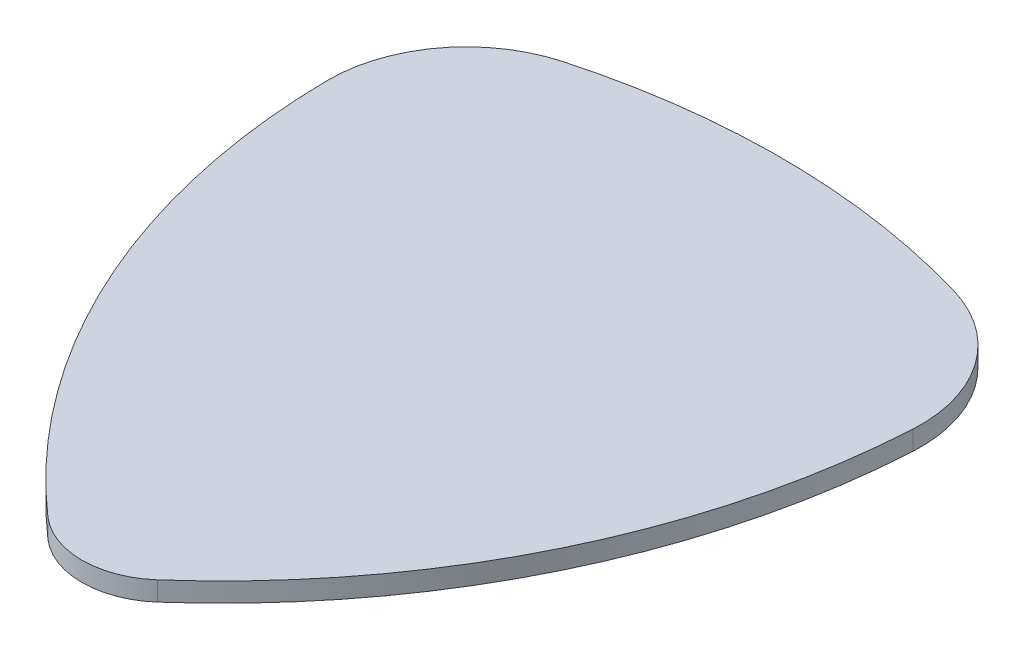
ISO-10303-21;
HEADER;
FILE_DESCRIPTION(('STEP AP214'),'2;1');
FILE_NAME('part.step','',(''),(''),'','','');
FILE_SCHEMA(('AUTOMOTIVE_DESIGN { 1 0 10303 214 1 1 1 1 }'));
ENDSEC;
DATA;
#1=APPLICATION_CONTEXT('core data for automotive mechanical design processes');
#2=APPLICATION_PROTOCOL_DEFINITION('international standard','automotive_design',2000,#1);
#3=PRODUCT_CONTEXT('',#1,'mechanical');
#4=PRODUCT('Part','Part','',(#3));
#5=PRODUCT_RELATED_PRODUCT_CATEGORY('part','',(#4));
#6=PRODUCT_DEFINITION_FORMATION('','',#4);
#7=PRODUCT_DEFINITION_CONTEXT('part definition',#1,'design');
#8=PRODUCT_DEFINITION('design','',#6,#7);
#9=PRODUCT_DEFINITION_SHAPE('','',#8);
#10=(LENGTH_UNIT() NAMED_UNIT(*) SI_UNIT(.MILLI.,.METRE.));
#11=(NAMED_UNIT(*) PLANE_ANGLE_UNIT() SI_UNIT($,.RADIAN.));
#12=(NAMED_UNIT(*) SI_UNIT($,.STERADIAN.) SOLID_ANGLE_UNIT());
#13=UNCERTAINTY_MEASURE_WITH_UNIT(LENGTH_MEASURE(1.E-05),#10,'distance_accuracy_value','');
#14=(GEOMETRIC_REPRESENTATION_CONTEXT(3) GLOBAL_UNCERTAINTY_ASSIGNED_CONTEXT((#13)) GLOBAL_UNIT_ASSIGNED_CONTEXT((#10,
#11,#12)) REPRESENTATION_CONTEXT('',''));
#15=CARTESIAN_POINT('',(0.,0.,0.));
#16=DIRECTION('',(0.,0.,1.));
#17=DIRECTION('',(1.,0.,0.));
#18=AXIS2_PLACEMENT_3D('',#15,#16,#17);
#19=CARTESIAN_POINT('',(28.0766116363262,0.77,2.26023105070621));
#20=DIRECTION('',(0.,-1.,0.));
#21=DIRECTION('',(0.,0.,-1.));
#22=AXIS2_PLACEMENT_3D('',#19,#20,#21);
#23=CYLINDRICAL_SURFACE('',#22,30.4413324660989);
#24=CARTESIAN_POINT('',(28.0766116363262,-0.07,2.26023105070621));
#25=DIRECTION('',(0.,1.,0.));
#26=DIRECTION('',(0.,0.,1.));
#27=AXIS2_PLACEMENT_3D('',#24,#25,#26);
#28=CIRCLE('',#27,30.4413324660989);
#29=CARTESIAN_POINT('',(-2.36239634992725,-0.07,2.63641601101734));
#30=VERTEX_POINT('',#29);
#31=CARTESIAN_POINT('',(8.0082036083322,-0.07,25.1498295953184));
#32=VERTEX_POINT('',#31);
#33=EDGE_CURVE('E113',#30,#32,#28,.T.);
#34=ORIENTED_EDGE('',*,*,#33,.T.);
#35=DIRECTION('',(0.,-1.,0.));
#36=VECTOR('',#35,1.);
#37=CARTESIAN_POINT('',(8.0082036083322,0.77,25.1498295953184));
#38=LINE('',#37,#36);
#39=CARTESIAN_POINT('',(8.0082036083322,0.77,25.1498295953184));
#40=VERTEX_POINT('',#39);
#41=EDGE_CURVE('E42',#32,#40,#38,.F.);
#42=ORIENTED_EDGE('',*,*,#41,.T.);
#43=CARTESIAN_POINT('',(28.0766116363262,0.77,2.26023105070621));
#44=DIRECTION('',(0.,1.,0.));
#45=DIRECTION('',(0.,0.,1.));
#46=AXIS2_PLACEMENT_3D('',#43,#44,#45);
#47=CIRCLE('',#46,30.4413324660989);
#48=CARTESIAN_POINT('',(-2.36239634992725,0.77,2.63641601101734));
#49=VERTEX_POINT('',#48);
#50=EDGE_CURVE('E108',#49,#40,#47,.T.);
#51=ORIENTED_EDGE('',*,*,#50,.F.);
#52=DIRECTION('',(0.,-1.,0.));
#53=VECTOR('',#52,1.);
#54=CARTESIAN_POINT('',(-2.36239634992725,0.77,2.63641601101734));
#55=LINE('',#54,#53);
#56=EDGE_CURVE('E120',#49,#30,#55,.T.);
#57=ORIENTED_EDGE('',*,*,#56,.T.);
#58=EDGE_LOOP('',(#34,#42,#51,#57));
#59=FACE_BOUND('',#58,.T.);
#60=ADVANCED_FACE('F34',(#59),#23,.T.);
#61=CARTESIAN_POINT('',(-8.36288794006831,0.77,1.18447516824585));
#62=DIRECTION('',(0.,-1.,0.));
#63=DIRECTION('',(0.,0.,-1.));
#64=AXIS2_PLACEMENT_3D('',#61,#62,#63);
#65=CYLINDRICAL_SURFACE('',#64,31.9420649633992);
#66=CARTESIAN_POINT('',(-8.36288794006831,0.77,1.18447516824585));
#67=DIRECTION('',(0.,1.,0.));
#68=DIRECTION('',(0.,0.,-1.));
#69=AXIS2_PLACEMENT_3D('',#66,#67,#68);
#70=CIRCLE('',#69,31.9420649633992);
#71=CARTESIAN_POINT('',(12.762404825313,0.77,25.143137896014));
#72=VERTEX_POINT('',#71);
#73=CARTESIAN_POINT('',(23.5266246198363,0.77,3.01600535301041));
#74=VERTEX_POINT('',#73);
#75=EDGE_CURVE('E111',#72,#74,#70,.T.);
#76=ORIENTED_EDGE('',*,*,#75,.F.);
#77=DIRECTION('',(0.,-1.,0.));
#78=VECTOR('',#77,1.);
#79=CARTESIAN_POINT('',(12.762404825313,0.77,25.143137896014));
#80=LINE('',#79,#78);
#81=CARTESIAN_POINT('',(12.762404825313,-0.07,25.143137896014));
#82=VERTEX_POINT('',#81);
#83=EDGE_CURVE('E128',#72,#82,#80,.T.);
#84=ORIENTED_EDGE('',*,*,#83,.T.);
#85=CARTESIAN_POINT('',(-8.36288794006831,-0.07,1.18447516824585));
#86=DIRECTION('',(0.,1.,0.));
#87=DIRECTION('',(0.,0.,-1.));
#88=AXIS2_PLACEMENT_3D('',#85,#86,#87);
#89=CIRCLE('',#88,31.9420649633992);
#90=CARTESIAN_POINT('',(23.5266246198363,-0.07,3.01600535301041));
#91=VERTEX_POINT('',#90);
#92=EDGE_CURVE('E109',#82,#91,#89,.T.);
#93=ORIENTED_EDGE('',*,*,#92,.T.);
#94=DIRECTION('',(0.,-1.,0.));
#95=VECTOR('',#94,1.);
#96=CARTESIAN_POINT('',(23.5266246198363,0.77,3.01600535301041));
#97=LINE('',#96,#95);
#98=EDGE_CURVE('E94',#91,#74,#97,.F.);
#99=ORIENTED_EDGE('',*,*,#98,.T.);
#100=EDGE_LOOP('',(#76,#84,#93,#99));
#101=FACE_BOUND('',#100,.T.);
#102=ADVANCED_FACE('F134',(#101),#65,.T.);
#103=CARTESIAN_POINT('',(10.3940684173081,0.77,27.0393026156201));
#104=DIRECTION('',(0.,-1.,0.));
#105=DIRECTION('',(0.,0.,-1.));
#106=AXIS2_PLACEMENT_3D('',#103,#104,#105);
#107=CYLINDRICAL_SURFACE('',#106,31.3925410963892);
#108=CARTESIAN_POINT('',(10.3940684173081,-0.07,27.0393026156201));
#109=DIRECTION('',(0.,1.,0.));
#110=DIRECTION('',(0.,0.,-1.));
#111=AXIS2_PLACEMENT_3D('',#108,#109,#110);
#112=CIRCLE('',#111,31.3925410963892);
#113=CARTESIAN_POINT('',(19.2241793023884,-0.07,-3.08578291530704));
#114=VERTEX_POINT('',#113);
#115=CARTESIAN_POINT('',(2.04055311737948,-0.07,-3.22140488804457));
#116=VERTEX_POINT('',#115);
#117=EDGE_CURVE('E101',#114,#116,#112,.T.);
#118=ORIENTED_EDGE('',*,*,#117,.T.);
#119=DIRECTION('',(0.,-1.,0.));
#120=VECTOR('',#119,1.);
#121=CARTESIAN_POINT('',(2.04055311737948,0.77,-3.22140488804457));
#122=LINE('',#121,#120);
#123=CARTESIAN_POINT('',(2.04055311737948,0.77,-3.22140488804457));
#124=VERTEX_POINT('',#123);
#125=EDGE_CURVE('E124',#116,#124,#122,.F.);
#126=ORIENTED_EDGE('',*,*,#125,.T.);
#127=CARTESIAN_POINT('',(10.3940684173081,0.77,27.0393026156201));
#128=DIRECTION('',(0.,1.,0.));
#129=DIRECTION('',(0.,0.,-1.));
#130=AXIS2_PLACEMENT_3D('',#127,#128,#129);
#131=CIRCLE('',#130,31.3925410963892);
#132=CARTESIAN_POINT('',(19.2241793023884,0.77,-3.08578291530704));
#133=VERTEX_POINT('',#132);
#134=EDGE_CURVE('E104',#133,#124,#131,.T.);
#135=ORIENTED_EDGE('',*,*,#134,.F.);
#136=DIRECTION('',(0.,-1.,0.));
#137=VECTOR('',#136,1.);
#138=CARTESIAN_POINT('',(19.2241793023884,0.77,-3.08578291530704));
#139=LINE('',#138,#137);
#140=EDGE_CURVE('E92',#133,#114,#139,.T.);
#141=ORIENTED_EDGE('',*,*,#140,.T.);
#142=EDGE_LOOP('',(#118,#126,#135,#141));
#143=FACE_BOUND('',#142,.T.);
#144=ADVANCED_FACE('F100',(#143),#107,.T.);
#145=CARTESIAN_POINT('',(9.85686184812896,0.77,1.72235310947603));
#146=DIRECTION('',(0.,1.,0.));
#147=DIRECTION('',(0.,0.,1.));
#148=AXIS2_PLACEMENT_3D('',#145,#146,#147);
#149=PLANE('',#148);
#150=ORIENTED_EDGE('',*,*,#50,.T.);
#151=CARTESIAN_POINT('',(10.3814988305842,0.77,22.4428996390699));
#152=DIRECTION('',(0.,1.,0.));
#153=DIRECTION('',(0.,0.,1.));
#154=AXIS2_PLACEMENT_3D('',#151,#152,#153);
#155=CIRCLE('',#154,3.6);
#156=EDGE_CURVE('E11',#40,#72,#155,.T.);
#157=ORIENTED_EDGE('',*,*,#156,.T.);
#158=ORIENTED_EDGE('',*,*,#75,.T.);
#159=CARTESIAN_POINT('',(17.5364960674503,0.77,2.67197057876588));
#160=DIRECTION('',(0.,1.,0.));
#161=DIRECTION('',(0.,0.,1.));
#162=AXIS2_PLACEMENT_3D('',#159,#160,#161);
#163=CIRCLE('',#162,6.);
#164=EDGE_CURVE('E118',#74,#133,#163,.T.);
#165=ORIENTED_EDGE('',*,*,#164,.T.);
#166=ORIENTED_EDGE('',*,*,#134,.T.);
#167=CARTESIAN_POINT('',(3.63714549407423,0.77,2.56226979010601));
#168=DIRECTION('',(0.,1.,0.));
#169=DIRECTION('',(0.,0.,1.));
#170=AXIS2_PLACEMENT_3D('',#167,#168,#169);
#171=CIRCLE('',#170,6.);
#172=EDGE_CURVE('E126',#124,#49,#171,.T.);
#173=ORIENTED_EDGE('',*,*,#172,.T.);
#174=EDGE_LOOP('',(#150,#157,#158,#165,#166,#173));
#175=FACE_BOUND('',#174,.T.);
#176=ADVANCED_FACE('F138',(#175),#149,.T.);
#177=CARTESIAN_POINT('',(9.85686184812896,-0.07,1.72235310947603));
#178=DIRECTION('',(0.,1.,0.));
#179=DIRECTION('',(0.,0.,1.));
#180=AXIS2_PLACEMENT_3D('',#177,#178,#179);
#181=PLANE('',#180);
#182=ORIENTED_EDGE('',*,*,#92,.F.);
#183=CARTESIAN_POINT('',(10.3814988305842,-0.07,22.4428996390699));
#184=DIRECTION('',(0.,1.,0.));
#185=DIRECTION('',(0.,0.,1.));
#186=AXIS2_PLACEMENT_3D('',#183,#184,#185);
#187=CIRCLE('',#186,3.6);
#188=EDGE_CURVE('E56',#82,#32,#187,.F.);
#189=ORIENTED_EDGE('',*,*,#188,.T.);
#190=ORIENTED_EDGE('',*,*,#33,.F.);
#191=CARTESIAN_POINT('',(3.63714549407423,-0.07,2.56226979010601));
#192=DIRECTION('',(0.,1.,0.));
#193=DIRECTION('',(0.,0.,1.));
#194=AXIS2_PLACEMENT_3D('',#191,#192,#193);
#195=CIRCLE('',#194,6.);
#196=EDGE_CURVE('E107',#30,#116,#195,.F.);
#197=ORIENTED_EDGE('',*,*,#196,.T.);
#198=ORIENTED_EDGE('',*,*,#117,.F.);
#199=CARTESIAN_POINT('',(17.5364960674503,-0.07,2.67197057876588));
#200=DIRECTION('',(0.,1.,0.));
#201=DIRECTION('',(0.,0.,1.));
#202=AXIS2_PLACEMENT_3D('',#199,#200,#201);
#203=CIRCLE('',#202,6.);
#204=EDGE_CURVE('E88',#114,#91,#203,.F.);
#205=ORIENTED_EDGE('',*,*,#204,.T.);
#206=EDGE_LOOP('',(#182,#189,#190,#197,#198,#205));
#207=FACE_BOUND('',#206,.T.);
#208=ADVANCED_FACE('F106',(#207),#181,.F.);
#209=CARTESIAN_POINT('',(17.5364960674503,0.77,2.67197057876588));
#210=DIRECTION('',(0.,-1.,0.));
#211=DIRECTION('',(0.,0.,-1.));
#212=AXIS2_PLACEMENT_3D('',#209,#210,#211);
#213=CYLINDRICAL_SURFACE('',#212,6.);
#214=ORIENTED_EDGE('',*,*,#164,.F.);
#215=ORIENTED_EDGE('',*,*,#98,.F.);
#216=ORIENTED_EDGE('',*,*,#204,.F.);
#217=ORIENTED_EDGE('',*,*,#140,.F.);
#218=EDGE_LOOP('',(#214,#215,#216,#217));
#219=FACE_BOUND('',#218,.T.);
#220=ADVANCED_FACE('F91',(#219),#213,.T.);
#221=CARTESIAN_POINT('',(3.63714549407423,0.77,2.56226979010601));
#222=DIRECTION('',(0.,-1.,0.));
#223=DIRECTION('',(0.,0.,-1.));
#224=AXIS2_PLACEMENT_3D('',#221,#222,#223);
#225=CYLINDRICAL_SURFACE('',#224,6.);
#226=ORIENTED_EDGE('',*,*,#172,.F.);
#227=ORIENTED_EDGE('',*,*,#125,.F.);
#228=ORIENTED_EDGE('',*,*,#196,.F.);
#229=ORIENTED_EDGE('',*,*,#56,.F.);
#230=EDGE_LOOP('',(#226,#227,#228,#229));
#231=FACE_BOUND('',#230,.T.);
#232=ADVANCED_FACE('F142',(#231),#225,.T.);
#233=CARTESIAN_POINT('',(10.3814988305842,0.77,22.4428996390699));
#234=DIRECTION('',(0.,-1.,0.));
#235=DIRECTION('',(0.,0.,-1.));
#236=AXIS2_PLACEMENT_3D('',#233,#234,#235);
#237=CYLINDRICAL_SURFACE('',#236,3.6);
#238=ORIENTED_EDGE('',*,*,#156,.F.);
#239=ORIENTED_EDGE('',*,*,#41,.F.);
#240=ORIENTED_EDGE('',*,*,#188,.F.);
#241=ORIENTED_EDGE('',*,*,#83,.F.);
#242=EDGE_LOOP('',(#238,#239,#240,#241));
#243=FACE_BOUND('',#242,.T.);
#244=ADVANCED_FACE('F36',(#243),#237,.T.);
#245=CLOSED_SHELL('',(#60,#102,#144,#176,#208,#220,#232,#244));
#246=MANIFOLD_SOLID_BREP('B2',#245);
#247=ADVANCED_BREP_SHAPE_REPRESENTATION('',(#18,#246),#14);
#248=SHAPE_DEFINITION_REPRESENTATION(#9,#247);
ENDSEC;
END-ISO-10303-21;
